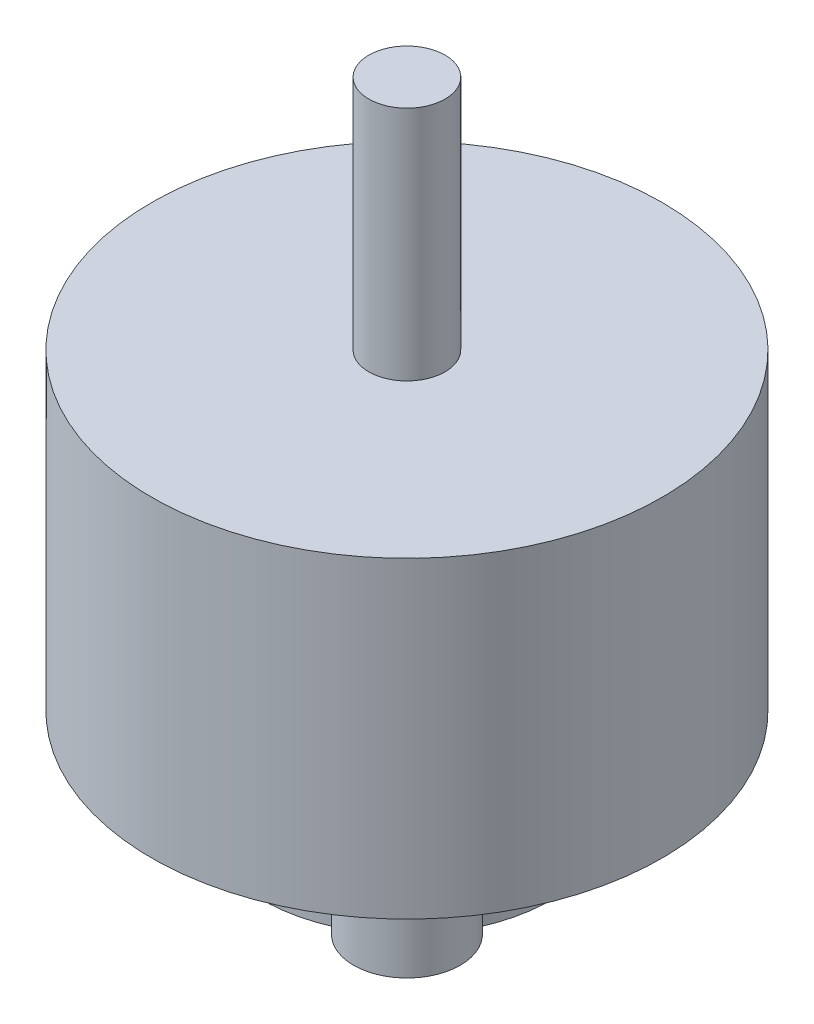
ISO-10303-21;
HEADER;
FILE_DESCRIPTION(('STEP AP214'),'2;1');
FILE_NAME('part.step','',(''),(''),'','','');
FILE_SCHEMA(('AUTOMOTIVE_DESIGN { 1 0 10303 214 1 1 1 1 }'));
ENDSEC;
DATA;
#1=APPLICATION_CONTEXT('core data for automotive mechanical design processes');
#2=APPLICATION_PROTOCOL_DEFINITION('international standard','automotive_design',2000,#1);
#3=PRODUCT_CONTEXT('',#1,'mechanical');
#4=PRODUCT('Part','Part','',(#3));
#5=PRODUCT_RELATED_PRODUCT_CATEGORY('part','',(#4));
#6=PRODUCT_DEFINITION_FORMATION('','',#4);
#7=PRODUCT_DEFINITION_CONTEXT('part definition',#1,'design');
#8=PRODUCT_DEFINITION('design','',#6,#7);
#9=PRODUCT_DEFINITION_SHAPE('','',#8);
#10=(LENGTH_UNIT() NAMED_UNIT(*) SI_UNIT(.MILLI.,.METRE.));
#11=(NAMED_UNIT(*) PLANE_ANGLE_UNIT() SI_UNIT($,.RADIAN.));
#12=(NAMED_UNIT(*) SI_UNIT($,.STERADIAN.) SOLID_ANGLE_UNIT());
#13=UNCERTAINTY_MEASURE_WITH_UNIT(LENGTH_MEASURE(1.E-05),#10,'distance_accuracy_value','');
#14=(GEOMETRIC_REPRESENTATION_CONTEXT(3) GLOBAL_UNCERTAINTY_ASSIGNED_CONTEXT((#13)) GLOBAL_UNIT_ASSIGNED_CONTEXT((#10,
#11,#12)) REPRESENTATION_CONTEXT('',''));
#15=CARTESIAN_POINT('',(0.,0.,0.));
#16=DIRECTION('',(0.,0.,1.));
#17=DIRECTION('',(1.,0.,0.));
#18=AXIS2_PLACEMENT_3D('',#15,#16,#17);
#19=CARTESIAN_POINT('',(0.,0.,0.));
#20=DIRECTION('',(0.,1.,0.));
#21=DIRECTION('',(0.,0.,1.));
#22=AXIS2_PLACEMENT_3D('',#19,#20,#21);
#23=PLANE('',#22);
#24=CARTESIAN_POINT('',(-6.71751442127217,0.,-6.71751442127224));
#25=DIRECTION('',(0.,-1.,0.));
#26=DIRECTION('',(0.,0.,-1.));
#27=AXIS2_PLACEMENT_3D('',#24,#25,#26);
#28=CIRCLE('',#27,1.7);
#29=CARTESIAN_POINT('',(-6.71751442127217,0.,-8.41751442127223));
#30=VERTEX_POINT('',#29);
#31=EDGE_CURVE('E207',#30,#30,#28,.T.);
#32=ORIENTED_EDGE('',*,*,#31,.F.);
#33=EDGE_LOOP('',(#32));
#34=FACE_BOUND('',#33,.T.);
#35=CARTESIAN_POINT('',(0.,0.,0.));
#36=DIRECTION('',(0.,-1.,0.));
#37=DIRECTION('',(0.,0.,-1.));
#38=AXIS2_PLACEMENT_3D('',#35,#36,#37);
#39=CIRCLE('',#38,9.5);
#40=CARTESIAN_POINT('',(-8.69413737876269,0.,3.82909587751488));
#41=VERTEX_POINT('',#40);
#42=CARTESIAN_POINT('',(-8.69413737876277,0.,-3.82909587751469));
#43=VERTEX_POINT('',#42);
#44=EDGE_CURVE('E11',#41,#43,#39,.T.);
#45=ORIENTED_EDGE('',*,*,#44,.T.);
#46=CARTESIAN_POINT('',(-6.71751442127231,0.,-6.7175144212721));
#47=DIRECTION('',(0.,-1.,0.));
#48=DIRECTION('',(0.,0.,-1.));
#49=AXIS2_PLACEMENT_3D('',#46,#47,#48);
#50=CIRCLE('',#49,3.5);
#51=CARTESIAN_POINT('',(-3.82909587751496,0.,-8.69413737876265));
#52=VERTEX_POINT('',#51);
#53=EDGE_CURVE('E113',#43,#52,#50,.T.);
#54=ORIENTED_EDGE('',*,*,#53,.T.);
#55=CARTESIAN_POINT('',(3.82909587751472,0.,-8.69413737876276));
#56=VERTEX_POINT('',#55);
#57=EDGE_CURVE('E39',#52,#56,#39,.T.);
#58=ORIENTED_EDGE('',*,*,#57,.T.);
#59=CARTESIAN_POINT('',(6.71751442127212,0.,-6.71751442127228));
#60=DIRECTION('',(0.,-1.,0.));
#61=DIRECTION('',(0.,0.,-1.));
#62=AXIS2_PLACEMENT_3D('',#59,#60,#61);
#63=CIRCLE('',#62,3.5);
#64=CARTESIAN_POINT('',(8.69413737876267,0.,-3.82909587751493));
#65=VERTEX_POINT('',#64);
#66=EDGE_CURVE('E110',#56,#65,#63,.T.);
#67=ORIENTED_EDGE('',*,*,#66,.T.);
#68=CARTESIAN_POINT('',(8.69413737876275,0.,3.82909587751475));
#69=VERTEX_POINT('',#68);
#70=EDGE_CURVE('E170',#65,#69,#39,.T.);
#71=ORIENTED_EDGE('',*,*,#70,.T.);
#72=CARTESIAN_POINT('',(6.71751442127226,0.,6.71751442127214));
#73=DIRECTION('',(0.,-1.,0.));
#74=DIRECTION('',(0.,0.,-1.));
#75=AXIS2_PLACEMENT_3D('',#72,#73,#74);
#76=CIRCLE('',#75,3.5);
#77=CARTESIAN_POINT('',(3.8290958775149,0.,8.69413737876268));
#78=VERTEX_POINT('',#77);
#79=EDGE_CURVE('E128',#69,#78,#76,.T.);
#80=ORIENTED_EDGE('',*,*,#79,.T.);
#81=CARTESIAN_POINT('',(-3.82909587751479,0.,8.69413737876273));
#82=VERTEX_POINT('',#81);
#83=EDGE_CURVE('E40',#78,#82,#39,.T.);
#84=ORIENTED_EDGE('',*,*,#83,.T.);
#85=CARTESIAN_POINT('',(-6.71751442127217,0.,6.71751442127224));
#86=DIRECTION('',(0.,-1.,0.));
#87=DIRECTION('',(0.,0.,-1.));
#88=AXIS2_PLACEMENT_3D('',#85,#86,#87);
#89=CIRCLE('',#88,3.5);
#90=EDGE_CURVE('E140',#82,#41,#89,.T.);
#91=ORIENTED_EDGE('',*,*,#90,.T.);
#92=EDGE_LOOP('',(#45,#54,#58,#67,#71,#80,#84,#91));
#93=FACE_BOUND('',#92,.T.);
#94=CARTESIAN_POINT('',(6.71751442127221,0.,-6.71751442127219));
#95=DIRECTION('',(0.,-1.,0.));
#96=DIRECTION('',(0.,0.,-1.));
#97=AXIS2_PLACEMENT_3D('',#94,#95,#96);
#98=CIRCLE('',#97,1.7);
#99=CARTESIAN_POINT('',(6.71751442127221,0.,-8.41751442127218));
#100=VERTEX_POINT('',#99);
#101=EDGE_CURVE('E213',#100,#100,#98,.T.);
#102=ORIENTED_EDGE('',*,*,#101,.F.);
#103=EDGE_LOOP('',(#102));
#104=FACE_BOUND('',#103,.T.);
#105=CARTESIAN_POINT('',(6.71751442127217,0.,6.71751442127224));
#106=DIRECTION('',(0.,-1.,0.));
#107=DIRECTION('',(0.,0.,-1.));
#108=AXIS2_PLACEMENT_3D('',#105,#106,#107);
#109=CIRCLE('',#108,1.7);
#110=CARTESIAN_POINT('',(6.71751442127217,0.,5.01751442127224));
#111=VERTEX_POINT('',#110);
#112=EDGE_CURVE('E221',#111,#111,#109,.T.);
#113=ORIENTED_EDGE('',*,*,#112,.F.);
#114=EDGE_LOOP('',(#113));
#115=FACE_BOUND('',#114,.T.);
#116=CARTESIAN_POINT('',(-6.71751442127217,0.,6.71751442127224));
#117=DIRECTION('',(0.,-1.,0.));
#118=DIRECTION('',(0.,0.,-1.));
#119=AXIS2_PLACEMENT_3D('',#116,#117,#118);
#120=CIRCLE('',#119,1.7);
#121=CARTESIAN_POINT('',(-6.71751442127217,0.,5.01751442127224));
#122=VERTEX_POINT('',#121);
#123=EDGE_CURVE('E227',#122,#122,#120,.T.);
#124=ORIENTED_EDGE('',*,*,#123,.F.);
#125=EDGE_LOOP('',(#124));
#126=FACE_BOUND('',#125,.T.);
#127=ADVANCED_FACE('F32',(#34,#93,#104,#115,#126),#23,.F.);
#128=CARTESIAN_POINT('',(0.,0.,0.));
#129=DIRECTION('',(0.,-1.,0.));
#130=DIRECTION('',(0.,0.,-1.));
#131=AXIS2_PLACEMENT_3D('',#128,#129,#130);
#132=CYLINDRICAL_SURFACE('',#131,9.5);
#133=ORIENTED_EDGE('',*,*,#57,.F.);
#134=DIRECTION('',(0.,-1.,0.));
#135=VECTOR('',#134,1.);
#136=CARTESIAN_POINT('',(-3.82909587751496,1.75,-8.69413737876265));
#137=LINE('',#136,#135);
#138=CARTESIAN_POINT('',(-3.82909587751496,3.5,-8.69413737876265));
#139=VERTEX_POINT('',#138);
#140=EDGE_CURVE('E105',#52,#139,#137,.F.);
#141=ORIENTED_EDGE('',*,*,#140,.T.);
#142=CARTESIAN_POINT('',(0.,3.5,0.));
#143=DIRECTION('',(0.,-1.,0.));
#144=DIRECTION('',(0.,0.,-1.));
#145=AXIS2_PLACEMENT_3D('',#142,#143,#144);
#146=CIRCLE('',#145,9.5);
#147=CARTESIAN_POINT('',(3.82909587751472,3.5,-8.69413737876276));
#148=VERTEX_POINT('',#147);
#149=EDGE_CURVE('E96',#139,#148,#146,.T.);
#150=ORIENTED_EDGE('',*,*,#149,.T.);
#151=DIRECTION('',(0.,-1.,0.));
#152=VECTOR('',#151,1.);
#153=CARTESIAN_POINT('',(3.82909587751472,1.75,-8.69413737876276));
#154=LINE('',#153,#152);
#155=EDGE_CURVE('E123',#148,#56,#154,.T.);
#156=ORIENTED_EDGE('',*,*,#155,.T.);
#157=EDGE_LOOP('',(#133,#141,#150,#156));
#158=FACE_BOUND('',#157,.T.);
#159=ADVANCED_FACE('F106',(#158),#132,.T.);
#160=ORIENTED_EDGE('',*,*,#70,.F.);
#161=DIRECTION('',(0.,-1.,0.));
#162=VECTOR('',#161,1.);
#163=CARTESIAN_POINT('',(8.69413737876267,1.75,-3.82909587751493));
#164=LINE('',#163,#162);
#165=CARTESIAN_POINT('',(8.69413737876267,3.5,-3.82909587751493));
#166=VERTEX_POINT('',#165);
#167=EDGE_CURVE('E125',#65,#166,#164,.F.);
#168=ORIENTED_EDGE('',*,*,#167,.T.);
#169=CARTESIAN_POINT('',(8.69413737876274,3.5,3.82909587751476));
#170=VERTEX_POINT('',#169);
#171=EDGE_CURVE('E104',#166,#170,#146,.T.);
#172=ORIENTED_EDGE('',*,*,#171,.T.);
#173=DIRECTION('',(0.,-1.,0.));
#174=VECTOR('',#173,1.);
#175=CARTESIAN_POINT('',(8.69413737876275,1.75,3.82909587751475));
#176=LINE('',#175,#174);
#177=EDGE_CURVE('E134',#170,#69,#176,.T.);
#178=ORIENTED_EDGE('',*,*,#177,.T.);
#179=EDGE_LOOP('',(#160,#168,#172,#178));
#180=FACE_BOUND('',#179,.T.);
#181=ADVANCED_FACE('F175',(#180),#132,.T.);
#182=ORIENTED_EDGE('',*,*,#83,.F.);
#183=DIRECTION('',(0.,-1.,0.));
#184=VECTOR('',#183,1.);
#185=CARTESIAN_POINT('',(3.8290958775149,1.75,8.69413737876268));
#186=LINE('',#185,#184);
#187=CARTESIAN_POINT('',(3.8290958775149,3.5,8.69413737876268));
#188=VERTEX_POINT('',#187);
#189=EDGE_CURVE('E137',#78,#188,#186,.F.);
#190=ORIENTED_EDGE('',*,*,#189,.T.);
#191=CARTESIAN_POINT('',(-3.82909587751479,3.5,8.69413737876273));
#192=VERTEX_POINT('',#191);
#193=EDGE_CURVE('E169',#188,#192,#146,.T.);
#194=ORIENTED_EDGE('',*,*,#193,.T.);
#195=DIRECTION('',(0.,-1.,0.));
#196=VECTOR('',#195,1.);
#197=CARTESIAN_POINT('',(-3.82909587751479,1.75,8.69413737876273));
#198=LINE('',#197,#196);
#199=EDGE_CURVE('E146',#192,#82,#198,.T.);
#200=ORIENTED_EDGE('',*,*,#199,.T.);
#201=EDGE_LOOP('',(#182,#190,#194,#200));
#202=FACE_BOUND('',#201,.T.);
#203=ADVANCED_FACE('F183',(#202),#132,.T.);
#204=CARTESIAN_POINT('',(-8.69413737876269,3.5,3.82909587751488));
#205=VERTEX_POINT('',#204);
#206=CARTESIAN_POINT('',(-8.69413737876277,3.5,-3.8290958775147));
#207=VERTEX_POINT('',#206);
#208=EDGE_CURVE('E103',#205,#207,#146,.T.);
#209=ORIENTED_EDGE('',*,*,#208,.T.);
#210=DIRECTION('',(0.,-1.,0.));
#211=VECTOR('',#210,1.);
#212=CARTESIAN_POINT('',(-8.69413737876277,1.75,-3.82909587751469));
#213=LINE('',#212,#211);
#214=EDGE_CURVE('E54',#207,#43,#213,.T.);
#215=ORIENTED_EDGE('',*,*,#214,.T.);
#216=ORIENTED_EDGE('',*,*,#44,.F.);
#217=DIRECTION('',(0.,-1.,0.));
#218=VECTOR('',#217,1.);
#219=CARTESIAN_POINT('',(-8.69413737876269,1.75,3.82909587751488));
#220=LINE('',#219,#218);
#221=EDGE_CURVE('E149',#41,#205,#220,.F.);
#222=ORIENTED_EDGE('',*,*,#221,.T.);
#223=EDGE_LOOP('',(#209,#215,#216,#222));
#224=FACE_BOUND('',#223,.T.);
#225=ADVANCED_FACE('F204',(#224),#132,.T.);
#226=CARTESIAN_POINT('',(-9.5,3.5,0.));
#227=DIRECTION('',(0.,-1.,0.));
#228=DIRECTION('',(0.,0.,-1.));
#229=AXIS2_PLACEMENT_3D('',#226,#227,#228);
#230=PLANE('',#229);
#231=CARTESIAN_POINT('',(-6.71751442127217,3.5,6.71751442127224));
#232=DIRECTION('',(0.,-1.,0.));
#233=DIRECTION('',(0.,0.,-1.));
#234=AXIS2_PLACEMENT_3D('',#231,#232,#233);
#235=CIRCLE('',#234,1.7);
#236=CARTESIAN_POINT('',(-6.71751442127217,3.5,5.01751442127224));
#237=VERTEX_POINT('',#236);
#238=EDGE_CURVE('E224',#237,#237,#235,.T.);
#239=ORIENTED_EDGE('',*,*,#238,.T.);
#240=EDGE_LOOP('',(#239));
#241=FACE_BOUND('',#240,.T.);
#242=CARTESIAN_POINT('',(6.71751442127217,3.5,6.71751442127224));
#243=DIRECTION('',(0.,-1.,0.));
#244=DIRECTION('',(0.,0.,-1.));
#245=AXIS2_PLACEMENT_3D('',#242,#243,#244);
#246=CIRCLE('',#245,1.7);
#247=CARTESIAN_POINT('',(6.71751442127217,3.5,5.01751442127224));
#248=VERTEX_POINT('',#247);
#249=EDGE_CURVE('E218',#248,#248,#246,.T.);
#250=ORIENTED_EDGE('',*,*,#249,.T.);
#251=EDGE_LOOP('',(#250));
#252=FACE_BOUND('',#251,.T.);
#253=CARTESIAN_POINT('',(6.71751442127221,3.5,-6.71751442127219));
#254=DIRECTION('',(0.,-1.,0.));
#255=DIRECTION('',(0.,0.,-1.));
#256=AXIS2_PLACEMENT_3D('',#253,#254,#255);
#257=CIRCLE('',#256,1.7);
#258=CARTESIAN_POINT('',(6.71751442127221,3.5,-8.41751442127219));
#259=VERTEX_POINT('',#258);
#260=EDGE_CURVE('E209',#259,#259,#257,.T.);
#261=ORIENTED_EDGE('',*,*,#260,.T.);
#262=EDGE_LOOP('',(#261));
#263=FACE_BOUND('',#262,.T.);
#264=CARTESIAN_POINT('',(-6.71751442127217,3.5,-6.71751442127224));
#265=DIRECTION('',(0.,-1.,0.));
#266=DIRECTION('',(0.,0.,-1.));
#267=AXIS2_PLACEMENT_3D('',#264,#265,#266);
#268=CIRCLE('',#267,1.7);
#269=CARTESIAN_POINT('',(-6.71751442127217,3.5,-8.41751442127224));
#270=VERTEX_POINT('',#269);
#271=EDGE_CURVE('E116',#270,#270,#268,.T.);
#272=ORIENTED_EDGE('',*,*,#271,.T.);
#273=EDGE_LOOP('',(#272));
#274=FACE_BOUND('',#273,.T.);
#275=CARTESIAN_POINT('',(0.,3.5,0.));
#276=DIRECTION('',(0.,-1.,0.));
#277=DIRECTION('',(0.,0.,-1.));
#278=AXIS2_PLACEMENT_3D('',#275,#276,#277);
#279=CIRCLE('',#278,7.5);
#280=CARTESIAN_POINT('',(0.,3.5,-7.5));
#281=VERTEX_POINT('',#280);
#282=EDGE_CURVE('E167',#281,#281,#279,.T.);
#283=ORIENTED_EDGE('',*,*,#282,.T.);
#284=EDGE_LOOP('',(#283));
#285=FACE_BOUND('',#284,.T.);
#286=ORIENTED_EDGE('',*,*,#149,.F.);
#287=CARTESIAN_POINT('',(-6.71751442127231,3.5,-6.7175144212721));
#288=DIRECTION('',(0.,-1.,0.));
#289=DIRECTION('',(0.,0.,-1.));
#290=AXIS2_PLACEMENT_3D('',#287,#288,#289);
#291=CIRCLE('',#290,3.5);
#292=EDGE_CURVE('E99',#139,#207,#291,.F.);
#293=ORIENTED_EDGE('',*,*,#292,.T.);
#294=ORIENTED_EDGE('',*,*,#208,.F.);
#295=CARTESIAN_POINT('',(-6.71751442127217,3.5,6.71751442127224));
#296=DIRECTION('',(0.,-1.,0.));
#297=DIRECTION('',(0.,0.,-1.));
#298=AXIS2_PLACEMENT_3D('',#295,#296,#297);
#299=CIRCLE('',#298,3.5);
#300=EDGE_CURVE('E143',#205,#192,#299,.F.);
#301=ORIENTED_EDGE('',*,*,#300,.T.);
#302=ORIENTED_EDGE('',*,*,#193,.F.);
#303=CARTESIAN_POINT('',(6.71751442127226,3.5,6.71751442127214));
#304=DIRECTION('',(0.,-1.,0.));
#305=DIRECTION('',(0.,0.,-1.));
#306=AXIS2_PLACEMENT_3D('',#303,#304,#305);
#307=CIRCLE('',#306,3.5);
#308=EDGE_CURVE('E131',#188,#170,#307,.F.);
#309=ORIENTED_EDGE('',*,*,#308,.T.);
#310=ORIENTED_EDGE('',*,*,#171,.F.);
#311=CARTESIAN_POINT('',(6.71751442127212,3.5,-6.71751442127228));
#312=DIRECTION('',(0.,-1.,0.));
#313=DIRECTION('',(0.,0.,-1.));
#314=AXIS2_PLACEMENT_3D('',#311,#312,#313);
#315=CIRCLE('',#314,3.5);
#316=EDGE_CURVE('E101',#166,#148,#315,.F.);
#317=ORIENTED_EDGE('',*,*,#316,.T.);
#318=EDGE_LOOP('',(#286,#293,#294,#301,#302,#309,#310,#317));
#319=FACE_BOUND('',#318,.T.);
#320=ADVANCED_FACE('F97',(#241,#252,#263,#274,#285,#319),#230,.F.);
#321=CARTESIAN_POINT('',(0.,6.,0.));
#322=DIRECTION('',(0.,-1.,0.));
#323=DIRECTION('',(0.,0.,-1.));
#324=AXIS2_PLACEMENT_3D('',#321,#322,#323);
#325=CONICAL_SURFACE('',#324,6.75,0.291456794477867);
#326=ORIENTED_EDGE('',*,*,#282,.F.);
#327=EDGE_LOOP('',(#326));
#328=FACE_BOUND('',#327,.T.);
#329=CARTESIAN_POINT('',(0.,6.,0.));
#330=DIRECTION('',(0.,-1.,0.));
#331=DIRECTION('',(0.,0.,-1.));
#332=AXIS2_PLACEMENT_3D('',#329,#330,#331);
#333=CIRCLE('',#332,6.75);
#334=CARTESIAN_POINT('',(0.,6.,-6.75));
#335=VERTEX_POINT('',#334);
#336=EDGE_CURVE('E164',#335,#335,#333,.T.);
#337=ORIENTED_EDGE('',*,*,#336,.T.);
#338=EDGE_LOOP('',(#337));
#339=FACE_BOUND('',#338,.T.);
#340=ADVANCED_FACE('F256',(#328,#339),#325,.T.);
#341=CARTESIAN_POINT('',(-6.75,6.,0.));
#342=DIRECTION('',(0.,1.,0.));
#343=DIRECTION('',(0.,0.,1.));
#344=AXIS2_PLACEMENT_3D('',#341,#342,#343);
#345=PLANE('',#344);
#346=ORIENTED_EDGE('',*,*,#336,.F.);
#347=EDGE_LOOP('',(#346));
#348=FACE_BOUND('',#347,.T.);
#349=CARTESIAN_POINT('',(0.,6.,0.));
#350=DIRECTION('',(0.,-1.,0.));
#351=DIRECTION('',(0.,0.,-1.));
#352=AXIS2_PLACEMENT_3D('',#349,#350,#351);
#353=CIRCLE('',#352,16.75);
#354=CARTESIAN_POINT('',(0.,6.,-16.75));
#355=VERTEX_POINT('',#354);
#356=EDGE_CURVE('E161',#355,#355,#353,.T.);
#357=ORIENTED_EDGE('',*,*,#356,.T.);
#358=EDGE_LOOP('',(#357));
#359=FACE_BOUND('',#358,.T.);
#360=ADVANCED_FACE('F263',(#348,#359),#345,.F.);
#361=CARTESIAN_POINT('',(0.,0.,0.));
#362=DIRECTION('',(0.,-1.,0.));
#363=DIRECTION('',(0.,0.,-1.));
#364=AXIS2_PLACEMENT_3D('',#361,#362,#363);
#365=CYLINDRICAL_SURFACE('',#364,16.75);
#366=ORIENTED_EDGE('',*,*,#356,.F.);
#367=EDGE_LOOP('',(#366));
#368=FACE_BOUND('',#367,.T.);
#369=CARTESIAN_POINT('',(0.,26.5,0.));
#370=DIRECTION('',(0.,-1.,0.));
#371=DIRECTION('',(0.,0.,-1.));
#372=AXIS2_PLACEMENT_3D('',#369,#370,#371);
#373=CIRCLE('',#372,16.75);
#374=CARTESIAN_POINT('',(0.,26.5,-16.75));
#375=VERTEX_POINT('',#374);
#376=EDGE_CURVE('E158',#375,#375,#373,.T.);
#377=ORIENTED_EDGE('',*,*,#376,.T.);
#378=EDGE_LOOP('',(#377));
#379=FACE_BOUND('',#378,.T.);
#380=ADVANCED_FACE('F269',(#368,#379),#365,.T.);
#381=CARTESIAN_POINT('',(-16.75,26.5,0.));
#382=DIRECTION('',(0.,-1.,0.));
#383=DIRECTION('',(0.,0.,-1.));
#384=AXIS2_PLACEMENT_3D('',#381,#382,#383);
#385=PLANE('',#384);
#386=ORIENTED_EDGE('',*,*,#376,.F.);
#387=EDGE_LOOP('',(#386));
#388=FACE_BOUND('',#387,.T.);
#389=CARTESIAN_POINT('',(0.,26.5,0.));
#390=DIRECTION('',(0.,-1.,0.));
#391=DIRECTION('',(0.,0.,-1.));
#392=AXIS2_PLACEMENT_3D('',#389,#390,#391);
#393=CIRCLE('',#392,2.5);
#394=CARTESIAN_POINT('',(0.,26.5,-2.5));
#395=VERTEX_POINT('',#394);
#396=EDGE_CURVE('E155',#395,#395,#393,.T.);
#397=ORIENTED_EDGE('',*,*,#396,.T.);
#398=EDGE_LOOP('',(#397));
#399=FACE_BOUND('',#398,.T.);
#400=ADVANCED_FACE('F275',(#388,#399),#385,.F.);
#401=CARTESIAN_POINT('',(0.,0.,0.));
#402=DIRECTION('',(0.,-1.,0.));
#403=DIRECTION('',(0.,0.,-1.));
#404=AXIS2_PLACEMENT_3D('',#401,#402,#403);
#405=CYLINDRICAL_SURFACE('',#404,2.5);
#406=ORIENTED_EDGE('',*,*,#396,.F.);
#407=EDGE_LOOP('',(#406));
#408=FACE_BOUND('',#407,.T.);
#409=CARTESIAN_POINT('',(0.,42.,0.));
#410=DIRECTION('',(0.,-1.,0.));
#411=DIRECTION('',(0.,0.,-1.));
#412=AXIS2_PLACEMENT_3D('',#409,#410,#411);
#413=CIRCLE('',#412,2.5);
#414=CARTESIAN_POINT('',(0.,42.,-2.5));
#415=VERTEX_POINT('',#414);
#416=EDGE_CURVE('E152',#415,#415,#413,.T.);
#417=ORIENTED_EDGE('',*,*,#416,.T.);
#418=EDGE_LOOP('',(#417));
#419=FACE_BOUND('',#418,.T.);
#420=ADVANCED_FACE('F281',(#408,#419),#405,.T.);
#421=CARTESIAN_POINT('',(-2.5,42.,0.));
#422=DIRECTION('',(0.,-1.,0.));
#423=DIRECTION('',(0.,0.,-1.));
#424=AXIS2_PLACEMENT_3D('',#421,#422,#423);
#425=PLANE('',#424);
#426=ORIENTED_EDGE('',*,*,#416,.F.);
#427=EDGE_LOOP('',(#426));
#428=FACE_BOUND('',#427,.T.);
#429=ADVANCED_FACE('F287',(#428),#425,.F.);
#430=CARTESIAN_POINT('',(-6.71751442127217,13.3994949366117,6.71751442127224));
#431=DIRECTION('',(0.,-1.,0.));
#432=DIRECTION('',(0.,0.,-1.));
#433=AXIS2_PLACEMENT_3D('',#430,#431,#432);
#434=CYLINDRICAL_SURFACE('',#433,3.5);
#435=ORIENTED_EDGE('',*,*,#221,.F.);
#436=ORIENTED_EDGE('',*,*,#90,.F.);
#437=ORIENTED_EDGE('',*,*,#199,.F.);
#438=ORIENTED_EDGE('',*,*,#300,.F.);
#439=EDGE_LOOP('',(#435,#436,#437,#438));
#440=FACE_BOUND('',#439,.T.);
#441=ADVANCED_FACE('F197',(#440),#434,.T.);
#442=CARTESIAN_POINT('',(6.71751442127226,13.3994949366117,6.71751442127214));
#443=DIRECTION('',(0.,-1.,0.));
#444=DIRECTION('',(0.,0.,-1.));
#445=AXIS2_PLACEMENT_3D('',#442,#443,#444);
#446=CYLINDRICAL_SURFACE('',#445,3.5);
#447=ORIENTED_EDGE('',*,*,#189,.F.);
#448=ORIENTED_EDGE('',*,*,#79,.F.);
#449=ORIENTED_EDGE('',*,*,#177,.F.);
#450=ORIENTED_EDGE('',*,*,#308,.F.);
#451=EDGE_LOOP('',(#447,#448,#449,#450));
#452=FACE_BOUND('',#451,.T.);
#453=ADVANCED_FACE('F181',(#452),#446,.T.);
#454=CARTESIAN_POINT('',(6.71751442127212,13.3994949366117,-6.71751442127228));
#455=DIRECTION('',(0.,-1.,0.));
#456=DIRECTION('',(0.,0.,-1.));
#457=AXIS2_PLACEMENT_3D('',#454,#455,#456);
#458=CYLINDRICAL_SURFACE('',#457,3.5);
#459=ORIENTED_EDGE('',*,*,#167,.F.);
#460=ORIENTED_EDGE('',*,*,#66,.F.);
#461=ORIENTED_EDGE('',*,*,#155,.F.);
#462=ORIENTED_EDGE('',*,*,#316,.F.);
#463=EDGE_LOOP('',(#459,#460,#461,#462));
#464=FACE_BOUND('',#463,.T.);
#465=ADVANCED_FACE('F188',(#464),#458,.T.);
#466=CARTESIAN_POINT('',(-6.71751442127231,13.3994949366117,-6.7175144212721));
#467=DIRECTION('',(0.,-1.,0.));
#468=DIRECTION('',(0.,0.,-1.));
#469=AXIS2_PLACEMENT_3D('',#466,#467,#468);
#470=CYLINDRICAL_SURFACE('',#469,3.5);
#471=ORIENTED_EDGE('',*,*,#140,.F.);
#472=ORIENTED_EDGE('',*,*,#53,.F.);
#473=ORIENTED_EDGE('',*,*,#214,.F.);
#474=ORIENTED_EDGE('',*,*,#292,.F.);
#475=EDGE_LOOP('',(#471,#472,#473,#474));
#476=FACE_BOUND('',#475,.T.);
#477=ADVANCED_FACE('F112',(#476),#470,.T.);
#478=CARTESIAN_POINT('',(-6.71751442127217,0.,-6.71751442127224));
#479=DIRECTION('',(0.,-1.,0.));
#480=DIRECTION('',(0.,0.,-1.));
#481=AXIS2_PLACEMENT_3D('',#478,#479,#480);
#482=CYLINDRICAL_SURFACE('',#481,1.7);
#483=ORIENTED_EDGE('',*,*,#271,.F.);
#484=EDGE_LOOP('',(#483));
#485=FACE_BOUND('',#484,.T.);
#486=ORIENTED_EDGE('',*,*,#31,.T.);
#487=EDGE_LOOP('',(#486));
#488=FACE_BOUND('',#487,.T.);
#489=ADVANCED_FACE('F195',(#485,#488),#482,.F.);
#490=CARTESIAN_POINT('',(6.71751442127221,0.,-6.71751442127219));
#491=DIRECTION('',(0.,-1.,0.));
#492=DIRECTION('',(0.,0.,-1.));
#493=AXIS2_PLACEMENT_3D('',#490,#491,#492);
#494=CYLINDRICAL_SURFACE('',#493,1.7);
#495=ORIENTED_EDGE('',*,*,#260,.F.);
#496=EDGE_LOOP('',(#495));
#497=FACE_BOUND('',#496,.T.);
#498=ORIENTED_EDGE('',*,*,#101,.T.);
#499=EDGE_LOOP('',(#498));
#500=FACE_BOUND('',#499,.T.);
#501=ADVANCED_FACE('F240',(#497,#500),#494,.F.);
#502=CARTESIAN_POINT('',(6.71751442127217,0.,6.71751442127224));
#503=DIRECTION('',(0.,-1.,0.));
#504=DIRECTION('',(0.,0.,-1.));
#505=AXIS2_PLACEMENT_3D('',#502,#503,#504);
#506=CYLINDRICAL_SURFACE('',#505,1.7);
#507=ORIENTED_EDGE('',*,*,#249,.F.);
#508=EDGE_LOOP('',(#507));
#509=FACE_BOUND('',#508,.T.);
#510=ORIENTED_EDGE('',*,*,#112,.T.);
#511=EDGE_LOOP('',(#510));
#512=FACE_BOUND('',#511,.T.);
#513=ADVANCED_FACE('F234',(#509,#512),#506,.F.);
#514=CARTESIAN_POINT('',(-6.71751442127217,0.,6.71751442127224));
#515=DIRECTION('',(0.,-1.,0.));
#516=DIRECTION('',(0.,0.,-1.));
#517=AXIS2_PLACEMENT_3D('',#514,#515,#516);
#518=CYLINDRICAL_SURFACE('',#517,1.7);
#519=ORIENTED_EDGE('',*,*,#238,.F.);
#520=EDGE_LOOP('',(#519));
#521=FACE_BOUND('',#520,.T.);
#522=ORIENTED_EDGE('',*,*,#123,.T.);
#523=EDGE_LOOP('',(#522));
#524=FACE_BOUND('',#523,.T.);
#525=ADVANCED_FACE('F231',(#521,#524),#518,.F.);
#526=CLOSED_SHELL('',(#127,#159,#181,#203,#225,#320,#340,#360,#380,#400,#420,#429,#441,#453,
#465,#477,#489,#501,#513,#525));
#527=MANIFOLD_SOLID_BREP('B2',#526);
#528=ADVANCED_BREP_SHAPE_REPRESENTATION('',(#18,#527),#14);
#529=SHAPE_DEFINITION_REPRESENTATION(#9,#528);
ENDSEC;
END-ISO-10303-21;
